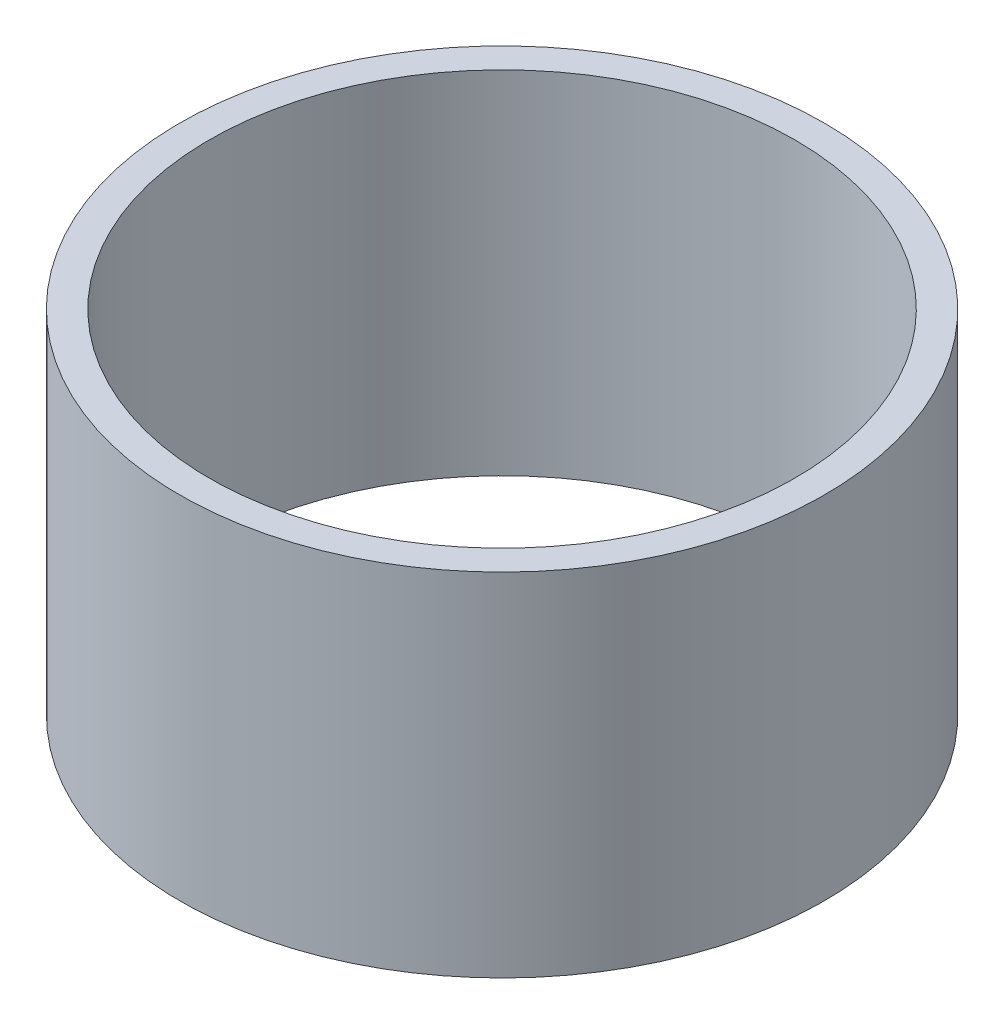
ISO-10303-21;
HEADER;
FILE_DESCRIPTION(('STEP AP214'),'2;1');
FILE_NAME('part.step','',(''),(''),'','','');
FILE_SCHEMA(('AUTOMOTIVE_DESIGN { 1 0 10303 214 1 1 1 1 }'));
ENDSEC;
DATA;
#1=APPLICATION_CONTEXT('core data for automotive mechanical design processes');
#2=APPLICATION_PROTOCOL_DEFINITION('international standard','automotive_design',2000,#1);
#3=PRODUCT_CONTEXT('',#1,'mechanical');
#4=PRODUCT('Part','Part','',(#3));
#5=PRODUCT_RELATED_PRODUCT_CATEGORY('part','',(#4));
#6=PRODUCT_DEFINITION_FORMATION('','',#4);
#7=PRODUCT_DEFINITION_CONTEXT('part definition',#1,'design');
#8=PRODUCT_DEFINITION('design','',#6,#7);
#9=PRODUCT_DEFINITION_SHAPE('','',#8);
#10=(LENGTH_UNIT() NAMED_UNIT(*) SI_UNIT(.MILLI.,.METRE.));
#11=(NAMED_UNIT(*) PLANE_ANGLE_UNIT() SI_UNIT($,.RADIAN.));
#12=(NAMED_UNIT(*) SI_UNIT($,.STERADIAN.) SOLID_ANGLE_UNIT());
#13=UNCERTAINTY_MEASURE_WITH_UNIT(LENGTH_MEASURE(1.E-05),#10,'distance_accuracy_value','');
#14=(GEOMETRIC_REPRESENTATION_CONTEXT(3) GLOBAL_UNCERTAINTY_ASSIGNED_CONTEXT((#13)) GLOBAL_UNIT_ASSIGNED_CONTEXT((#10,
#11,#12)) REPRESENTATION_CONTEXT('',''));
#15=CARTESIAN_POINT('',(0.,0.,0.));
#16=DIRECTION('',(0.,0.,1.));
#17=DIRECTION('',(1.,0.,0.));
#18=AXIS2_PLACEMENT_3D('',#15,#16,#17);
#19=CARTESIAN_POINT('',(0.,38.1,0.));
#20=DIRECTION('',(0.,1.,0.));
#21=DIRECTION('',(0.,0.,1.));
#22=AXIS2_PLACEMENT_3D('',#19,#20,#21);
#23=PLANE('',#22);
#24=CARTESIAN_POINT('',(0.,38.1,0.));
#25=DIRECTION('',(0.,1.,0.));
#26=DIRECTION('',(0.,0.,1.));
#27=AXIS2_PLACEMENT_3D('',#24,#25,#26);
#28=CIRCLE('',#27,34.925);
#29=CARTESIAN_POINT('',(0.,38.1,-34.925));
#30=VERTEX_POINT('',#29);
#31=EDGE_CURVE('E10',#30,#30,#28,.T.);
#32=ORIENTED_EDGE('',*,*,#31,.T.);
#33=EDGE_LOOP('',(#32));
#34=FACE_BOUND('',#33,.T.);
#35=CARTESIAN_POINT('',(0.,38.1,0.));
#36=DIRECTION('',(0.,1.,0.));
#37=DIRECTION('',(0.,0.,1.));
#38=AXIS2_PLACEMENT_3D('',#35,#36,#37);
#39=CIRCLE('',#38,31.75);
#40=CARTESIAN_POINT('',(0.,38.1,-31.75));
#41=VERTEX_POINT('',#40);
#42=EDGE_CURVE('E42',#41,#41,#39,.T.);
#43=ORIENTED_EDGE('',*,*,#42,.F.);
#44=EDGE_LOOP('',(#43));
#45=FACE_BOUND('',#44,.T.);
#46=ADVANCED_FACE('F31',(#34,#45),#23,.T.);
#47=CARTESIAN_POINT('',(0.,0.,0.));
#48=DIRECTION('',(0.,1.,0.));
#49=DIRECTION('',(0.,0.,1.));
#50=AXIS2_PLACEMENT_3D('',#47,#48,#49);
#51=PLANE('',#50);
#52=CARTESIAN_POINT('',(0.,0.,0.));
#53=DIRECTION('',(0.,1.,0.));
#54=DIRECTION('',(0.,0.,1.));
#55=AXIS2_PLACEMENT_3D('',#52,#53,#54);
#56=CIRCLE('',#55,34.925);
#57=CARTESIAN_POINT('',(0.,0.,-34.925));
#58=VERTEX_POINT('',#57);
#59=EDGE_CURVE('E35',#58,#58,#56,.T.);
#60=ORIENTED_EDGE('',*,*,#59,.F.);
#61=EDGE_LOOP('',(#60));
#62=FACE_BOUND('',#61,.T.);
#63=CARTESIAN_POINT('',(0.,0.,0.));
#64=DIRECTION('',(0.,1.,0.));
#65=DIRECTION('',(0.,0.,1.));
#66=AXIS2_PLACEMENT_3D('',#63,#64,#65);
#67=CIRCLE('',#66,31.75);
#68=CARTESIAN_POINT('',(0.,0.,-31.75));
#69=VERTEX_POINT('',#68);
#70=EDGE_CURVE('E44',#69,#69,#67,.T.);
#71=ORIENTED_EDGE('',*,*,#70,.T.);
#72=EDGE_LOOP('',(#71));
#73=FACE_BOUND('',#72,.T.);
#74=ADVANCED_FACE('F54',(#62,#73),#51,.F.);
#75=CARTESIAN_POINT('',(0.,38.1,0.));
#76=DIRECTION('',(0.,-1.,0.));
#77=DIRECTION('',(0.,0.,-1.));
#78=AXIS2_PLACEMENT_3D('',#75,#76,#77);
#79=CYLINDRICAL_SURFACE('',#78,34.925);
#80=CARTESIAN_POINT('',(0.,38.1,-34.925));
#81=CARTESIAN_POINT('',(0.,37.703125,-34.925));
#82=CARTESIAN_POINT('',(0.,37.30625,-34.925));
#83=CARTESIAN_POINT('',(0.,36.5125,-34.925));
#84=CARTESIAN_POINT('',(0.,36.115625,-34.925));
#85=CARTESIAN_POINT('',(0.,35.321875,-34.925));
#86=CARTESIAN_POINT('',(0.,34.925,-34.925));
#87=CARTESIAN_POINT('',(0.,34.13125,-34.925));
#88=CARTESIAN_POINT('',(0.,33.734375,-34.925));
#89=CARTESIAN_POINT('',(0.,32.940625,-34.925));
#90=CARTESIAN_POINT('',(0.,32.54375,-34.925));
#91=CARTESIAN_POINT('',(0.,31.75,-34.925));
#92=CARTESIAN_POINT('',(0.,31.353125,-34.925));
#93=CARTESIAN_POINT('',(0.,30.559375,-34.925));
#94=CARTESIAN_POINT('',(0.,30.1625,-34.925));
#95=CARTESIAN_POINT('',(0.,29.36875,-34.925));
#96=CARTESIAN_POINT('',(0.,28.971875,-34.925));
#97=CARTESIAN_POINT('',(0.,28.178125,-34.925));
#98=CARTESIAN_POINT('',(0.,27.78125,-34.925));
#99=CARTESIAN_POINT('',(0.,26.9875,-34.925));
#100=CARTESIAN_POINT('',(0.,26.590625,-34.925));
#101=CARTESIAN_POINT('',(0.,25.796875,-34.925));
#102=CARTESIAN_POINT('',(0.,25.4,-34.925));
#103=CARTESIAN_POINT('',(0.,24.60625,-34.925));
#104=CARTESIAN_POINT('',(0.,24.209375,-34.925));
#105=CARTESIAN_POINT('',(0.,23.415625,-34.925));
#106=CARTESIAN_POINT('',(0.,23.01875,-34.925));
#107=CARTESIAN_POINT('',(0.,22.225,-34.925));
#108=CARTESIAN_POINT('',(0.,21.828125,-34.925));
#109=CARTESIAN_POINT('',(0.,21.034375,-34.925));
#110=CARTESIAN_POINT('',(0.,20.6375,-34.925));
#111=CARTESIAN_POINT('',(0.,19.84375,-34.925));
#112=CARTESIAN_POINT('',(0.,19.446875,-34.925));
#113=CARTESIAN_POINT('',(0.,18.653125,-34.925));
#114=CARTESIAN_POINT('',(0.,18.25625,-34.925));
#115=CARTESIAN_POINT('',(0.,17.4625,-34.925));
#116=CARTESIAN_POINT('',(0.,17.065625,-34.925));
#117=CARTESIAN_POINT('',(0.,16.271875,-34.925));
#118=CARTESIAN_POINT('',(0.,15.875,-34.925));
#119=CARTESIAN_POINT('',(0.,15.08125,-34.925));
#120=CARTESIAN_POINT('',(0.,14.684375,-34.925));
#121=CARTESIAN_POINT('',(0.,13.890625,-34.925));
#122=CARTESIAN_POINT('',(0.,13.49375,-34.925));
#123=CARTESIAN_POINT('',(0.,12.7,-34.925));
#124=CARTESIAN_POINT('',(0.,12.303125,-34.925));
#125=CARTESIAN_POINT('',(0.,11.509375,-34.925));
#126=CARTESIAN_POINT('',(0.,11.1125,-34.925));
#127=CARTESIAN_POINT('',(0.,10.31875,-34.925));
#128=CARTESIAN_POINT('',(0.,9.921875,-34.925));
#129=CARTESIAN_POINT('',(0.,9.128125,-34.925));
#130=CARTESIAN_POINT('',(0.,8.73125,-34.925));
#131=CARTESIAN_POINT('',(0.,7.9375,-34.925));
#132=CARTESIAN_POINT('',(0.,7.540625,-34.925));
#133=CARTESIAN_POINT('',(0.,6.746875,-34.925));
#134=CARTESIAN_POINT('',(0.,6.35,-34.925));
#135=CARTESIAN_POINT('',(0.,5.55625,-34.925));
#136=CARTESIAN_POINT('',(0.,5.159375,-34.925));
#137=CARTESIAN_POINT('',(0.,4.365625,-34.925));
#138=CARTESIAN_POINT('',(0.,3.96875,-34.925));
#139=CARTESIAN_POINT('',(0.,3.175,-34.925));
#140=CARTESIAN_POINT('',(0.,2.778125,-34.925));
#141=CARTESIAN_POINT('',(0.,1.984375,-34.925));
#142=CARTESIAN_POINT('',(0.,1.5875,-34.925));
#143=CARTESIAN_POINT('',(0.,0.79375,-34.925));
#144=CARTESIAN_POINT('',(0.,0.396875,-34.925));
#145=CARTESIAN_POINT('',(0.,0.,-34.925));
#146=B_SPLINE_CURVE_WITH_KNOTS('',3,(#80,#81,#82,#83,#84,#85,#86,#87,#88,#89,#90,#91,#92,#93,
#94,#95,#96,#97,#98,#99,#100,#101,#102,#103,#104,#105,#106,#107,#108,#109,#110,#111,#112,#113,
#114,#115,#116,#117,#118,#119,#120,#121,#122,#123,#124,#125,#126,#127,#128,#129,#130,#131,#132,
#133,#134,#135,#136,#137,#138,#139,#140,#141,#142,#143,#144,#145),.UNSPECIFIED.,.F.,.F.,(4,2,2,
2,2,2,2,2,2,2,2,2,2,2,2,2,2,2,2,2,2,2,2,2,2,2,2,2,2,2,2,2,4),(0.,1.19062499999999,
2.38124999999999,3.571875,4.7625,5.953125,7.14375,8.33437499999999,9.525,10.715625,11.90625,
13.096875,14.2875,15.478125,16.66875,17.859375,19.05,20.240625,21.43125,22.621875,23.8125,
25.003125,26.19375,27.384375,28.575,29.765625,30.95625,32.146875,33.3375,34.528125,35.71875,
36.909375,38.1),.UNSPECIFIED.);
#147=EDGE_CURVE('BSEAM33',#30,#58,#146,.T.);
#148=ORIENTED_EDGE('',*,*,#31,.F.);
#149=ORIENTED_EDGE('',*,*,#59,.T.);
#150=ORIENTED_EDGE('',*,*,#147,.T.);
#151=ORIENTED_EDGE('',*,*,#147,.F.);
#152=EDGE_LOOP('',(#148,#150,#149,#151));
#153=FACE_BOUND('',#152,.T.);
#154=ADVANCED_FACE('F33',(#153),#79,.T.);
#155=CARTESIAN_POINT('',(0.,38.1,0.));
#156=DIRECTION('',(0.,-1.,0.));
#157=DIRECTION('',(0.,0.,-1.));
#158=AXIS2_PLACEMENT_3D('',#155,#156,#157);
#159=CYLINDRICAL_SURFACE('',#158,31.75);
#160=CARTESIAN_POINT('',(0.,38.1,-31.75));
#161=CARTESIAN_POINT('',(0.,37.703125,-31.75));
#162=CARTESIAN_POINT('',(0.,37.30625,-31.75));
#163=CARTESIAN_POINT('',(0.,36.5125,-31.75));
#164=CARTESIAN_POINT('',(0.,36.115625,-31.75));
#165=CARTESIAN_POINT('',(0.,35.321875,-31.75));
#166=CARTESIAN_POINT('',(0.,34.925,-31.75));
#167=CARTESIAN_POINT('',(0.,34.13125,-31.75));
#168=CARTESIAN_POINT('',(0.,33.734375,-31.75));
#169=CARTESIAN_POINT('',(0.,32.940625,-31.75));
#170=CARTESIAN_POINT('',(0.,32.54375,-31.75));
#171=CARTESIAN_POINT('',(0.,31.75,-31.75));
#172=CARTESIAN_POINT('',(0.,31.353125,-31.75));
#173=CARTESIAN_POINT('',(0.,30.559375,-31.75));
#174=CARTESIAN_POINT('',(0.,30.1625,-31.75));
#175=CARTESIAN_POINT('',(0.,29.36875,-31.75));
#176=CARTESIAN_POINT('',(0.,28.971875,-31.75));
#177=CARTESIAN_POINT('',(0.,28.178125,-31.75));
#178=CARTESIAN_POINT('',(0.,27.78125,-31.75));
#179=CARTESIAN_POINT('',(0.,26.9875,-31.75));
#180=CARTESIAN_POINT('',(0.,26.590625,-31.75));
#181=CARTESIAN_POINT('',(0.,25.796875,-31.75));
#182=CARTESIAN_POINT('',(0.,25.4,-31.75));
#183=CARTESIAN_POINT('',(0.,24.60625,-31.75));
#184=CARTESIAN_POINT('',(0.,24.209375,-31.75));
#185=CARTESIAN_POINT('',(0.,23.415625,-31.75));
#186=CARTESIAN_POINT('',(0.,23.01875,-31.75));
#187=CARTESIAN_POINT('',(0.,22.225,-31.75));
#188=CARTESIAN_POINT('',(0.,21.828125,-31.75));
#189=CARTESIAN_POINT('',(0.,21.034375,-31.75));
#190=CARTESIAN_POINT('',(0.,20.6375,-31.75));
#191=CARTESIAN_POINT('',(0.,19.84375,-31.75));
#192=CARTESIAN_POINT('',(0.,19.446875,-31.75));
#193=CARTESIAN_POINT('',(0.,18.653125,-31.75));
#194=CARTESIAN_POINT('',(0.,18.25625,-31.75));
#195=CARTESIAN_POINT('',(0.,17.4625,-31.75));
#196=CARTESIAN_POINT('',(0.,17.065625,-31.75));
#197=CARTESIAN_POINT('',(0.,16.271875,-31.75));
#198=CARTESIAN_POINT('',(0.,15.875,-31.75));
#199=CARTESIAN_POINT('',(0.,15.08125,-31.75));
#200=CARTESIAN_POINT('',(0.,14.684375,-31.75));
#201=CARTESIAN_POINT('',(0.,13.890625,-31.75));
#202=CARTESIAN_POINT('',(0.,13.49375,-31.75));
#203=CARTESIAN_POINT('',(0.,12.7,-31.75));
#204=CARTESIAN_POINT('',(0.,12.303125,-31.75));
#205=CARTESIAN_POINT('',(0.,11.509375,-31.75));
#206=CARTESIAN_POINT('',(0.,11.1125,-31.75));
#207=CARTESIAN_POINT('',(0.,10.31875,-31.75));
#208=CARTESIAN_POINT('',(0.,9.921875,-31.75));
#209=CARTESIAN_POINT('',(0.,9.128125,-31.75));
#210=CARTESIAN_POINT('',(0.,8.73125,-31.75));
#211=CARTESIAN_POINT('',(0.,7.9375,-31.75));
#212=CARTESIAN_POINT('',(0.,7.540625,-31.75));
#213=CARTESIAN_POINT('',(0.,6.746875,-31.75));
#214=CARTESIAN_POINT('',(0.,6.35,-31.75));
#215=CARTESIAN_POINT('',(0.,5.55625,-31.75));
#216=CARTESIAN_POINT('',(0.,5.159375,-31.75));
#217=CARTESIAN_POINT('',(0.,4.365625,-31.75));
#218=CARTESIAN_POINT('',(0.,3.96875,-31.75));
#219=CARTESIAN_POINT('',(0.,3.175,-31.75));
#220=CARTESIAN_POINT('',(0.,2.778125,-31.75));
#221=CARTESIAN_POINT('',(0.,1.984375,-31.75));
#222=CARTESIAN_POINT('',(0.,1.5875,-31.75));
#223=CARTESIAN_POINT('',(0.,0.79375,-31.75));
#224=CARTESIAN_POINT('',(0.,0.396875,-31.75));
#225=CARTESIAN_POINT('',(0.,0.,-31.75));
#226=B_SPLINE_CURVE_WITH_KNOTS('',3,(#160,#161,#162,#163,#164,#165,#166,#167,#168,#169,#170,
#171,#172,#173,#174,#175,#176,#177,#178,#179,#180,#181,#182,#183,#184,#185,#186,#187,#188,#189,
#190,#191,#192,#193,#194,#195,#196,#197,#198,#199,#200,#201,#202,#203,#204,#205,#206,#207,#208,
#209,#210,#211,#212,#213,#214,#215,#216,#217,#218,#219,#220,#221,#222,#223,#224,#225),
.UNSPECIFIED.,.F.,.F.,(4,2,2,2,2,2,2,2,2,2,2,2,2,2,2,2,2,2,2,2,2,2,2,2,2,2,2,2,2,2,2,2,4),(0.,
1.19062499999999,2.38124999999999,3.571875,4.7625,5.953125,7.14375,8.33437499999999,9.525,
10.715625,11.90625,13.096875,14.2875,15.478125,16.66875,17.859375,19.05,20.240625,21.43125,
22.621875,23.8125,25.003125,26.19375,27.384375,28.575,29.765625,30.95625,32.146875,33.3375,
34.528125,35.71875,36.909375,38.1),.UNSPECIFIED.);
#227=EDGE_CURVE('BSEAM50',#41,#69,#226,.T.);
#228=ORIENTED_EDGE('',*,*,#42,.T.);
#229=ORIENTED_EDGE('',*,*,#70,.F.);
#230=ORIENTED_EDGE('',*,*,#227,.T.);
#231=ORIENTED_EDGE('',*,*,#227,.F.);
#232=EDGE_LOOP('',(#228,#230,#229,#231));
#233=FACE_BOUND('',#232,.T.);
#234=ADVANCED_FACE('F50',(#233),#159,.F.);
#235=CLOSED_SHELL('',(#46,#74,#154,#234));
#236=MANIFOLD_SOLID_BREP('B2',#235);
#237=ADVANCED_BREP_SHAPE_REPRESENTATION('',(#18,#236),#14);
#238=SHAPE_DEFINITION_REPRESENTATION(#9,#237);
ENDSEC;
END-ISO-10303-21;
